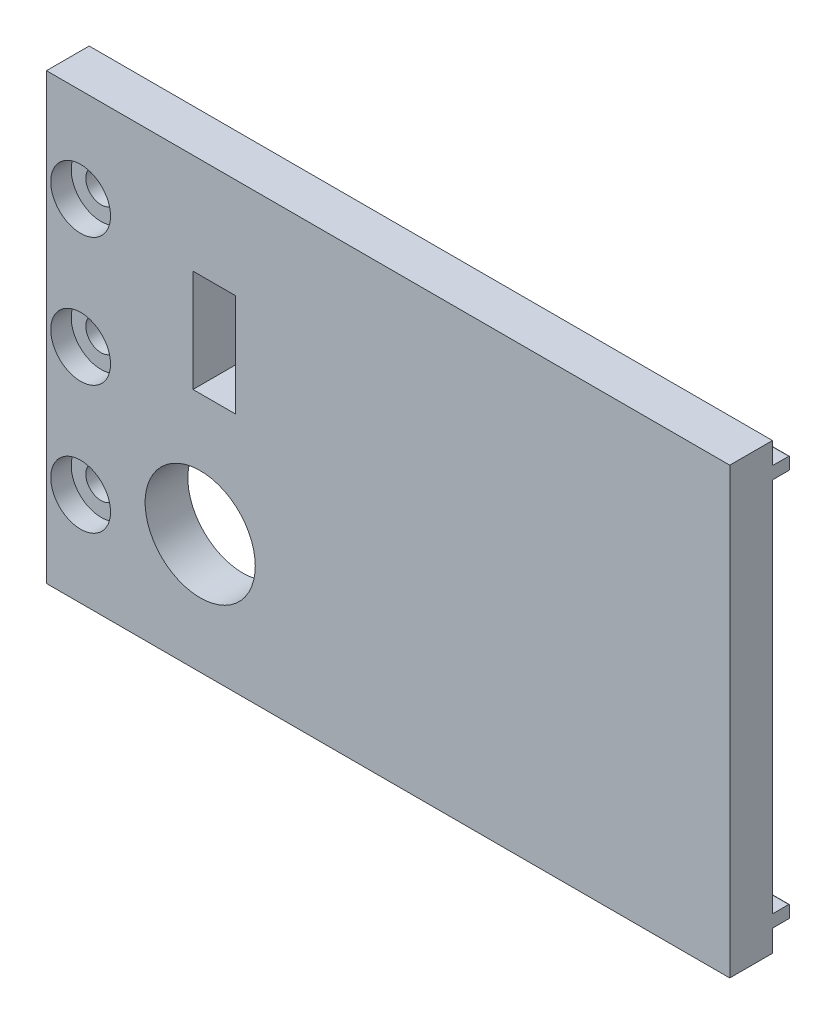
ISO-10303-21;
HEADER;
FILE_DESCRIPTION(('STEP AP214'),'2;1');
FILE_NAME('part.step','',(''),(''),'','','');
FILE_SCHEMA(('AUTOMOTIVE_DESIGN { 1 0 10303 214 1 1 1 1 }'));
ENDSEC;
DATA;
#1=APPLICATION_CONTEXT('core data for automotive mechanical design processes');
#2=APPLICATION_PROTOCOL_DEFINITION('international standard','automotive_design',2000,#1);
#3=PRODUCT_CONTEXT('',#1,'mechanical');
#4=PRODUCT('Part','Part','',(#3));
#5=PRODUCT_RELATED_PRODUCT_CATEGORY('part','',(#4));
#6=PRODUCT_DEFINITION_FORMATION('','',#4);
#7=PRODUCT_DEFINITION_CONTEXT('part definition',#1,'design');
#8=PRODUCT_DEFINITION('design','',#6,#7);
#9=PRODUCT_DEFINITION_SHAPE('','',#8);
#10=(LENGTH_UNIT() NAMED_UNIT(*) SI_UNIT(.MILLI.,.METRE.));
#11=(NAMED_UNIT(*) PLANE_ANGLE_UNIT() SI_UNIT($,.RADIAN.));
#12=(NAMED_UNIT(*) SI_UNIT($,.STERADIAN.) SOLID_ANGLE_UNIT());
#13=UNCERTAINTY_MEASURE_WITH_UNIT(LENGTH_MEASURE(1.E-05),#10,'distance_accuracy_value','');
#14=(GEOMETRIC_REPRESENTATION_CONTEXT(3) GLOBAL_UNCERTAINTY_ASSIGNED_CONTEXT((#13)) GLOBAL_UNIT_ASSIGNED_CONTEXT((#10,
#11,#12)) REPRESENTATION_CONTEXT('',''));
#15=CARTESIAN_POINT('',(0.,0.,0.));
#16=DIRECTION('',(0.,0.,1.));
#17=DIRECTION('',(1.,0.,0.));
#18=AXIS2_PLACEMENT_3D('',#15,#16,#17);
#19=CARTESIAN_POINT('',(0.,0.,16.9801166404574));
#20=DIRECTION('',(0.,0.,1.));
#21=DIRECTION('',(1.,0.,0.));
#22=AXIS2_PLACEMENT_3D('',#19,#20,#21);
#23=PLANE('',#22);
#24=DIRECTION('',(0.,1.,0.));
#25=VECTOR('',#24,1.);
#26=CARTESIAN_POINT('',(-76.4443030659333,46.0665693057306,16.9801166404574));
#27=LINE('',#26,#25);
#28=CARTESIAN_POINT('',(-76.4443030659333,45.9665693057306,16.9801166404574));
#29=VERTEX_POINT('',#28);
#30=CARTESIAN_POINT('',(-76.4443030659333,47.6165693057306,16.9801166404574));
#31=VERTEX_POINT('',#30);
#32=EDGE_CURVE('E249',#29,#31,#27,.T.);
#33=ORIENTED_EDGE('',*,*,#32,.F.);
#34=DIRECTION('',(-1.,0.,0.));
#35=VECTOR('',#34,1.);
#36=CARTESIAN_POINT('',(-4.4443030659333,45.9665693057306,16.9801166404574));
#37=LINE('',#36,#35);
#38=CARTESIAN_POINT('',(-4.44430306593331,45.9665693057306,16.9801166404574));
#39=VERTEX_POINT('',#38);
#40=EDGE_CURVE('E483',#29,#39,#37,.F.);
#41=ORIENTED_EDGE('',*,*,#40,.T.);
#42=DIRECTION('',(0.,1.,0.));
#43=VECTOR('',#42,1.);
#44=CARTESIAN_POINT('',(-4.44430306593331,50.0665693057306,16.9801166404574));
#45=LINE('',#44,#43);
#46=CARTESIAN_POINT('',(-4.4443030659333,2.16656930573062,16.9801166404574));
#47=VERTEX_POINT('',#46);
#48=EDGE_CURVE('E386',#47,#39,#45,.T.);
#49=ORIENTED_EDGE('',*,*,#48,.F.);
#50=DIRECTION('',(1.,0.,0.));
#51=VECTOR('',#50,1.);
#52=CARTESIAN_POINT('',(-76.4443030659333,2.16656930573061,16.9801166404574));
#53=LINE('',#52,#51);
#54=CARTESIAN_POINT('',(-76.4443030659333,2.16656930573061,16.9801166404574));
#55=VERTEX_POINT('',#54);
#56=EDGE_CURVE('E475',#47,#55,#53,.F.);
#57=ORIENTED_EDGE('',*,*,#56,.T.);
#58=DIRECTION('',(0.,1.,0.));
#59=VECTOR('',#58,1.);
#60=CARTESIAN_POINT('',(-76.4443030659333,2.06656930573061,16.9801166404574));
#61=LINE('',#60,#59);
#62=CARTESIAN_POINT('',(-76.4443030659333,0.516569305730608,16.9801166404574));
#63=VERTEX_POINT('',#62);
#64=EDGE_CURVE('E276',#63,#55,#61,.T.);
#65=ORIENTED_EDGE('',*,*,#64,.F.);
#66=DIRECTION('',(-1.,0.,0.));
#67=VECTOR('',#66,1.);
#68=CARTESIAN_POINT('',(-4.4443030659333,0.516569305730608,16.9801166404574));
#69=LINE('',#68,#67);
#70=CARTESIAN_POINT('',(-4.4443030659333,0.516569305730623,16.9801166404574));
#71=VERTEX_POINT('',#70);
#72=EDGE_CURVE('E472',#63,#71,#69,.F.);
#73=ORIENTED_EDGE('',*,*,#72,.T.);
#74=CARTESIAN_POINT('',(-4.4443030659333,-1.93343069426939,16.9801166404574));
#75=VERTEX_POINT('',#74);
#76=EDGE_CURVE('E382',#75,#71,#45,.T.);
#77=ORIENTED_EDGE('',*,*,#76,.F.);
#78=DIRECTION('',(1.,0.,0.));
#79=VECTOR('',#78,1.);
#80=CARTESIAN_POINT('',(-84.4443030659333,-1.93343069426939,16.9801166404574));
#81=LINE('',#80,#79);
#82=CARTESIAN_POINT('',(-84.4443030659333,-1.93343069426939,16.9801166404574));
#83=VERTEX_POINT('',#82);
#84=EDGE_CURVE('E378',#83,#75,#81,.T.);
#85=ORIENTED_EDGE('',*,*,#84,.F.);
#86=DIRECTION('',(0.,-1.,0.));
#87=VECTOR('',#86,1.);
#88=CARTESIAN_POINT('',(-84.4443030659333,50.0665693057306,16.9801166404574));
#89=LINE('',#88,#87);
#90=CARTESIAN_POINT('',(-84.4443030659333,50.0665693057306,16.9801166404574));
#91=VERTEX_POINT('',#90);
#92=EDGE_CURVE('E356',#91,#83,#89,.T.);
#93=ORIENTED_EDGE('',*,*,#92,.F.);
#94=DIRECTION('',(-1.,0.,0.));
#95=VECTOR('',#94,1.);
#96=CARTESIAN_POINT('',(-84.4443030659333,50.0665693057306,16.9801166404574));
#97=LINE('',#96,#95);
#98=CARTESIAN_POINT('',(-4.44430306593331,50.0665693057306,16.9801166404574));
#99=VERTEX_POINT('',#98);
#100=EDGE_CURVE('E365',#99,#91,#97,.T.);
#101=ORIENTED_EDGE('',*,*,#100,.F.);
#102=CARTESIAN_POINT('',(-4.44430306593331,47.6165693057306,16.9801166404574));
#103=VERTEX_POINT('',#102);
#104=EDGE_CURVE('E381',#103,#99,#45,.T.);
#105=ORIENTED_EDGE('',*,*,#104,.F.);
#106=DIRECTION('',(1.,0.,0.));
#107=VECTOR('',#106,1.);
#108=CARTESIAN_POINT('',(-76.4443030659333,47.6165693057306,16.9801166404574));
#109=LINE('',#108,#107);
#110=EDGE_CURVE('E479',#103,#31,#109,.F.);
#111=ORIENTED_EDGE('',*,*,#110,.T.);
#112=EDGE_LOOP('',(#33,#41,#49,#57,#65,#73,#77,#85,#93,#101,#105,#111));
#113=FACE_BOUND('',#112,.T.);
#114=CARTESIAN_POINT('',(-66.4443030659333,12.061734253213,16.9801166404574));
#115=DIRECTION('',(0.,0.,1.));
#116=DIRECTION('',(1.,0.,0.));
#117=AXIS2_PLACEMENT_3D('',#114,#115,#116);
#118=CIRCLE('',#117,6.44785946430932);
#119=CARTESIAN_POINT('',(-59.996443601624,12.061734253213,16.9801166404574));
#120=VERTEX_POINT('',#119);
#121=EDGE_CURVE('E352',#120,#120,#118,.T.);
#122=ORIENTED_EDGE('',*,*,#121,.T.);
#123=EDGE_LOOP('',(#122));
#124=FACE_BOUND('',#123,.T.);
#125=CARTESIAN_POINT('',(-80.4443030659333,39.0665693057306,16.9801166404574));
#126=DIRECTION('',(0.,0.,1.));
#127=DIRECTION('',(1.,0.,0.));
#128=AXIS2_PLACEMENT_3D('',#125,#126,#127);
#129=CIRCLE('',#128,1.8);
#130=CARTESIAN_POINT('',(-78.6443030659333,39.0665693057306,16.9801166404574));
#131=VERTEX_POINT('',#130);
#132=EDGE_CURVE('E347',#131,#131,#129,.T.);
#133=ORIENTED_EDGE('',*,*,#132,.T.);
#134=EDGE_LOOP('',(#133));
#135=FACE_BOUND('',#134,.T.);
#136=CARTESIAN_POINT('',(-80.4443030659333,24.0665693057306,16.9801166404574));
#137=DIRECTION('',(0.,0.,1.));
#138=DIRECTION('',(1.,0.,0.));
#139=AXIS2_PLACEMENT_3D('',#136,#137,#138);
#140=CIRCLE('',#139,1.8);
#141=CARTESIAN_POINT('',(-78.6443030659333,24.0665693057306,16.9801166404574));
#142=VERTEX_POINT('',#141);
#143=EDGE_CURVE('E331',#142,#142,#140,.T.);
#144=ORIENTED_EDGE('',*,*,#143,.T.);
#145=EDGE_LOOP('',(#144));
#146=FACE_BOUND('',#145,.T.);
#147=CARTESIAN_POINT('',(-80.4443030659333,9.06656930573061,16.9801166404574));
#148=DIRECTION('',(0.,0.,1.));
#149=DIRECTION('',(1.,0.,0.));
#150=AXIS2_PLACEMENT_3D('',#147,#148,#149);
#151=CIRCLE('',#150,1.8);
#152=CARTESIAN_POINT('',(-78.6443030659333,9.06656930573061,16.9801166404574));
#153=VERTEX_POINT('',#152);
#154=EDGE_CURVE('E315',#153,#153,#151,.T.);
#155=ORIENTED_EDGE('',*,*,#154,.T.);
#156=EDGE_LOOP('',(#155));
#157=FACE_BOUND('',#156,.T.);
#158=DIRECTION('',(1.,0.,0.));
#159=VECTOR('',#158,1.);
#160=CARTESIAN_POINT('',(0.,38.3184308689191,16.9801166404574));
#161=LINE('',#160,#159);
#162=CARTESIAN_POINT('',(-67.2884592835885,38.3184308689191,16.9801166404574));
#163=VERTEX_POINT('',#162);
#164=CARTESIAN_POINT('',(-62.2884592835885,38.3184308689191,16.9801166404574));
#165=VERTEX_POINT('',#164);
#166=EDGE_CURVE('E203',#163,#165,#161,.T.);
#167=ORIENTED_EDGE('',*,*,#166,.F.);
#168=DIRECTION('',(0.,-1.,0.));
#169=VECTOR('',#168,1.);
#170=CARTESIAN_POINT('',(-67.2884592835885,0.,16.9801166404574));
#171=LINE('',#170,#169);
#172=CARTESIAN_POINT('',(-67.2884592835885,26.3184308689191,16.9801166404574));
#173=VERTEX_POINT('',#172);
#174=EDGE_CURVE('E207',#163,#173,#171,.T.);
#175=ORIENTED_EDGE('',*,*,#174,.T.);
#176=DIRECTION('',(1.,0.,0.));
#177=VECTOR('',#176,1.);
#178=CARTESIAN_POINT('',(0.,26.318430868919,16.9801166404574));
#179=LINE('',#178,#177);
#180=CARTESIAN_POINT('',(-62.2884592835885,26.318430868919,16.9801166404574));
#181=VERTEX_POINT('',#180);
#182=EDGE_CURVE('E240',#173,#181,#179,.T.);
#183=ORIENTED_EDGE('',*,*,#182,.T.);
#184=DIRECTION('',(0.,-1.,0.));
#185=VECTOR('',#184,1.);
#186=CARTESIAN_POINT('',(-62.2884592835885,0.,16.9801166404574));
#187=LINE('',#186,#185);
#188=EDGE_CURVE('E244',#165,#181,#187,.T.);
#189=ORIENTED_EDGE('',*,*,#188,.F.);
#190=EDGE_LOOP('',(#167,#175,#183,#189));
#191=FACE_BOUND('',#190,.T.);
#192=ADVANCED_FACE('F39',(#113,#124,#135,#146,#157,#191),#23,.F.);
#193=CARTESIAN_POINT('',(0.,0.,21.9801166404574));
#194=DIRECTION('',(0.,0.,1.));
#195=DIRECTION('',(1.,0.,0.));
#196=AXIS2_PLACEMENT_3D('',#193,#194,#195);
#197=PLANE('',#196);
#198=CARTESIAN_POINT('',(-80.4443030659333,9.06656930573061,21.9801166404574));
#199=DIRECTION('',(0.,0.,1.));
#200=DIRECTION('',(1.,0.,0.));
#201=AXIS2_PLACEMENT_3D('',#198,#199,#200);
#202=CIRCLE('',#201,3.5);
#203=CARTESIAN_POINT('',(-76.9443030659333,9.06656930573061,21.9801166404574));
#204=VERTEX_POINT('',#203);
#205=EDGE_CURVE('E303',#204,#204,#202,.T.);
#206=ORIENTED_EDGE('',*,*,#205,.F.);
#207=EDGE_LOOP('',(#206));
#208=FACE_BOUND('',#207,.T.);
#209=CARTESIAN_POINT('',(-80.4443030659333,24.0665693057306,21.9801166404574));
#210=DIRECTION('',(0.,0.,1.));
#211=DIRECTION('',(1.,0.,0.));
#212=AXIS2_PLACEMENT_3D('',#209,#210,#211);
#213=CIRCLE('',#212,3.5);
#214=CARTESIAN_POINT('',(-76.9443030659333,24.0665693057306,21.9801166404574));
#215=VERTEX_POINT('',#214);
#216=EDGE_CURVE('E319',#215,#215,#213,.T.);
#217=ORIENTED_EDGE('',*,*,#216,.F.);
#218=EDGE_LOOP('',(#217));
#219=FACE_BOUND('',#218,.T.);
#220=CARTESIAN_POINT('',(-80.4443030659333,39.0665693057306,21.9801166404574));
#221=DIRECTION('',(0.,0.,1.));
#222=DIRECTION('',(1.,0.,0.));
#223=AXIS2_PLACEMENT_3D('',#220,#221,#222);
#224=CIRCLE('',#223,3.5);
#225=CARTESIAN_POINT('',(-76.9443030659333,39.0665693057306,21.9801166404574));
#226=VERTEX_POINT('',#225);
#227=EDGE_CURVE('E335',#226,#226,#224,.T.);
#228=ORIENTED_EDGE('',*,*,#227,.F.);
#229=EDGE_LOOP('',(#228));
#230=FACE_BOUND('',#229,.T.);
#231=CARTESIAN_POINT('',(-66.4443030659333,12.061734253213,21.9801166404574));
#232=DIRECTION('',(0.,0.,1.));
#233=DIRECTION('',(1.,0.,0.));
#234=AXIS2_PLACEMENT_3D('',#231,#232,#233);
#235=CIRCLE('',#234,6.44785946430932);
#236=CARTESIAN_POINT('',(-59.996443601624,12.061734253213,21.9801166404574));
#237=VERTEX_POINT('',#236);
#238=EDGE_CURVE('E351',#237,#237,#235,.T.);
#239=ORIENTED_EDGE('',*,*,#238,.F.);
#240=EDGE_LOOP('',(#239));
#241=FACE_BOUND('',#240,.T.);
#242=DIRECTION('',(0.,-1.,0.));
#243=VECTOR('',#242,1.);
#244=CARTESIAN_POINT('',(-84.4443030659333,50.0665693057306,21.9801166404574));
#245=LINE('',#244,#243);
#246=CARTESIAN_POINT('',(-84.4443030659333,50.0665693057306,21.9801166404574));
#247=VERTEX_POINT('',#246);
#248=CARTESIAN_POINT('',(-84.4443030659333,-1.93343069426939,21.9801166404574));
#249=VERTEX_POINT('',#248);
#250=EDGE_CURVE('E360',#247,#249,#245,.T.);
#251=ORIENTED_EDGE('',*,*,#250,.T.);
#252=DIRECTION('',(1.,0.,0.));
#253=VECTOR('',#252,1.);
#254=CARTESIAN_POINT('',(-84.4443030659333,-1.93343069426939,21.9801166404574));
#255=LINE('',#254,#253);
#256=CARTESIAN_POINT('',(-4.4443030659333,-1.93343069426939,21.9801166404574));
#257=VERTEX_POINT('',#256);
#258=EDGE_CURVE('E364',#249,#257,#255,.T.);
#259=ORIENTED_EDGE('',*,*,#258,.T.);
#260=DIRECTION('',(0.,1.,0.));
#261=VECTOR('',#260,1.);
#262=CARTESIAN_POINT('',(-4.44430306593331,50.0665693057306,21.9801166404574));
#263=LINE('',#262,#261);
#264=CARTESIAN_POINT('',(-4.44430306593331,50.0665693057306,21.9801166404574));
#265=VERTEX_POINT('',#264);
#266=EDGE_CURVE('E368',#257,#265,#263,.T.);
#267=ORIENTED_EDGE('',*,*,#266,.T.);
#268=DIRECTION('',(-1.,0.,0.));
#269=VECTOR('',#268,1.);
#270=CARTESIAN_POINT('',(-84.4443030659333,50.0665693057306,21.9801166404574));
#271=LINE('',#270,#269);
#272=EDGE_CURVE('E371',#265,#247,#271,.T.);
#273=ORIENTED_EDGE('',*,*,#272,.T.);
#274=EDGE_LOOP('',(#251,#259,#267,#273));
#275=FACE_BOUND('',#274,.T.);
#276=DIRECTION('',(0.,-1.,0.));
#277=VECTOR('',#276,1.);
#278=CARTESIAN_POINT('',(-67.2884592835885,38.3184308689191,21.9801166404574));
#279=LINE('',#278,#277);
#280=CARTESIAN_POINT('',(-67.2884592835885,38.3184308689191,21.9801166404574));
#281=VERTEX_POINT('',#280);
#282=CARTESIAN_POINT('',(-67.2884592835885,26.3184308689191,21.9801166404574));
#283=VERTEX_POINT('',#282);
#284=EDGE_CURVE('E222',#281,#283,#279,.T.);
#285=ORIENTED_EDGE('',*,*,#284,.F.);
#286=DIRECTION('',(1.,0.,0.));
#287=VECTOR('',#286,1.);
#288=CARTESIAN_POINT('',(-67.2884592835885,38.3184308689191,21.9801166404574));
#289=LINE('',#288,#287);
#290=CARTESIAN_POINT('',(-62.2884592835885,38.3184308689191,21.9801166404574));
#291=VERTEX_POINT('',#290);
#292=EDGE_CURVE('E63',#281,#291,#289,.T.);
#293=ORIENTED_EDGE('',*,*,#292,.T.);
#294=DIRECTION('',(0.,-1.,0.));
#295=VECTOR('',#294,1.);
#296=CARTESIAN_POINT('',(-62.2884592835885,38.3184308689191,21.9801166404574));
#297=LINE('',#296,#295);
#298=CARTESIAN_POINT('',(-62.2884592835885,26.318430868919,21.9801166404574));
#299=VERTEX_POINT('',#298);
#300=EDGE_CURVE('E211',#291,#299,#297,.T.);
#301=ORIENTED_EDGE('',*,*,#300,.T.);
#302=DIRECTION('',(1.,0.,0.));
#303=VECTOR('',#302,1.);
#304=CARTESIAN_POINT('',(-67.2884592835885,26.3184308689191,21.9801166404574));
#305=LINE('',#304,#303);
#306=EDGE_CURVE('E218',#283,#299,#305,.T.);
#307=ORIENTED_EDGE('',*,*,#306,.F.);
#308=EDGE_LOOP('',(#285,#293,#301,#307));
#309=FACE_BOUND('',#308,.T.);
#310=ADVANCED_FACE('F221',(#208,#219,#230,#241,#275,#309),#197,.T.);
#311=CARTESIAN_POINT('',(-84.4443030659333,50.0665693057306,21.9801166404574));
#312=DIRECTION('',(1.,0.,0.));
#313=DIRECTION('',(0.,1.,0.));
#314=AXIS2_PLACEMENT_3D('',#311,#312,#313);
#315=PLANE('',#314);
#316=ORIENTED_EDGE('',*,*,#92,.T.);
#317=DIRECTION('',(0.,0.,-1.));
#318=VECTOR('',#317,1.);
#319=CARTESIAN_POINT('',(-84.4443030659333,-1.93343069426939,21.9801166404574));
#320=LINE('',#319,#318);
#321=EDGE_CURVE('E400',#249,#83,#320,.T.);
#322=ORIENTED_EDGE('',*,*,#321,.F.);
#323=ORIENTED_EDGE('',*,*,#250,.F.);
#324=DIRECTION('',(0.,0.,-1.));
#325=VECTOR('',#324,1.);
#326=CARTESIAN_POINT('',(-84.4443030659333,50.0665693057306,21.9801166404574));
#327=LINE('',#326,#325);
#328=EDGE_CURVE('E374',#247,#91,#327,.T.);
#329=ORIENTED_EDGE('',*,*,#328,.T.);
#330=EDGE_LOOP('',(#316,#322,#323,#329));
#331=FACE_BOUND('',#330,.T.);
#332=ADVANCED_FACE('F530',(#331),#315,.F.);
#333=CARTESIAN_POINT('',(-84.4443030659333,-1.93343069426939,21.9801166404574));
#334=DIRECTION('',(0.,1.,0.));
#335=DIRECTION('',(0.,0.,1.));
#336=AXIS2_PLACEMENT_3D('',#333,#334,#335);
#337=PLANE('',#336);
#338=ORIENTED_EDGE('',*,*,#84,.T.);
#339=DIRECTION('',(0.,0.,-1.));
#340=VECTOR('',#339,1.);
#341=CARTESIAN_POINT('',(-4.4443030659333,-1.93343069426939,21.9801166404574));
#342=LINE('',#341,#340);
#343=EDGE_CURVE('E396',#257,#75,#342,.T.);
#344=ORIENTED_EDGE('',*,*,#343,.F.);
#345=ORIENTED_EDGE('',*,*,#258,.F.);
#346=ORIENTED_EDGE('',*,*,#321,.T.);
#347=EDGE_LOOP('',(#338,#344,#345,#346));
#348=FACE_BOUND('',#347,.T.);
#349=ADVANCED_FACE('F524',(#348),#337,.F.);
#350=CARTESIAN_POINT('',(-4.44430306593331,50.0665693057306,21.9801166404574));
#351=DIRECTION('',(-1.,0.,0.));
#352=DIRECTION('',(0.,-1.,0.));
#353=AXIS2_PLACEMENT_3D('',#350,#351,#352);
#354=PLANE('',#353);
#355=DIRECTION('',(0.,0.,1.));
#356=VECTOR('',#355,1.);
#357=CARTESIAN_POINT('',(-4.4443030659333,0.616569305730608,14.9801166404574));
#358=LINE('',#357,#356);
#359=CARTESIAN_POINT('',(-4.4443030659333,0.616569305730608,15.0801166404574));
#360=VERTEX_POINT('',#359);
#361=CARTESIAN_POINT('',(-4.4443030659333,0.616569305730608,16.8801166404574));
#362=VERTEX_POINT('',#361);
#363=EDGE_CURVE('E299',#360,#362,#358,.T.);
#364=ORIENTED_EDGE('',*,*,#363,.F.);
#365=CARTESIAN_POINT('',(-4.4443030659333,0.716569305730608,15.0801166404574));
#366=DIRECTION('',(-1.,0.,0.));
#367=DIRECTION('',(0.,-1.,0.));
#368=AXIS2_PLACEMENT_3D('',#365,#366,#367);
#369=CIRCLE('',#368,0.1);
#370=CARTESIAN_POINT('',(-4.4443030659333,0.716569305730608,14.9801166404574));
#371=VERTEX_POINT('',#370);
#372=EDGE_CURVE('E434',#360,#371,#369,.F.);
#373=ORIENTED_EDGE('',*,*,#372,.T.);
#374=DIRECTION('',(0.,-1.,0.));
#375=VECTOR('',#374,1.);
#376=CARTESIAN_POINT('',(-4.4443030659333,2.06656930573061,14.9801166404574));
#377=LINE('',#376,#375);
#378=CARTESIAN_POINT('',(-4.4443030659333,1.96656930573061,14.9801166404574));
#379=VERTEX_POINT('',#378);
#380=EDGE_CURVE('E277',#379,#371,#377,.T.);
#381=ORIENTED_EDGE('',*,*,#380,.F.);
#382=CARTESIAN_POINT('',(-4.4443030659333,1.96656930573061,15.0801166404574));
#383=DIRECTION('',(-1.,0.,0.));
#384=DIRECTION('',(0.,-1.,0.));
#385=AXIS2_PLACEMENT_3D('',#382,#383,#384);
#386=CIRCLE('',#385,0.1);
#387=CARTESIAN_POINT('',(-4.4443030659333,2.06656930573061,15.0801166404574));
#388=VERTEX_POINT('',#387);
#389=EDGE_CURVE('E431',#379,#388,#386,.F.);
#390=ORIENTED_EDGE('',*,*,#389,.T.);
#391=DIRECTION('',(0.,0.,1.));
#392=VECTOR('',#391,1.);
#393=CARTESIAN_POINT('',(-4.4443030659333,2.06656930573061,14.9801166404574));
#394=LINE('',#393,#392);
#395=CARTESIAN_POINT('',(-4.4443030659333,2.06656930573061,16.8801166404574));
#396=VERTEX_POINT('',#395);
#397=EDGE_CURVE('E285',#388,#396,#394,.T.);
#398=ORIENTED_EDGE('',*,*,#397,.T.);
#399=CARTESIAN_POINT('',(-4.4443030659333,2.16656930573061,16.8801166404574));
#400=DIRECTION('',(-1.,0.,0.));
#401=DIRECTION('',(0.,-1.,0.));
#402=AXIS2_PLACEMENT_3D('',#399,#400,#401);
#403=CIRCLE('',#402,0.1);
#404=EDGE_CURVE('E499',#396,#47,#403,.T.);
#405=ORIENTED_EDGE('',*,*,#404,.T.);
#406=ORIENTED_EDGE('',*,*,#48,.T.);
#407=CARTESIAN_POINT('',(-4.44430306593331,45.9665693057306,16.8801166404574));
#408=DIRECTION('',(-1.,0.,0.));
#409=DIRECTION('',(0.,-1.,0.));
#410=AXIS2_PLACEMENT_3D('',#407,#408,#409);
#411=CIRCLE('',#410,0.1);
#412=CARTESIAN_POINT('',(-4.4443030659333,46.0665693057306,16.8801166404574));
#413=VERTEX_POINT('',#412);
#414=EDGE_CURVE('E490',#39,#413,#411,.T.);
#415=ORIENTED_EDGE('',*,*,#414,.T.);
#416=DIRECTION('',(0.,0.,1.));
#417=VECTOR('',#416,1.);
#418=CARTESIAN_POINT('',(-4.4443030659333,46.0665693057306,14.9801166404574));
#419=LINE('',#418,#417);
#420=CARTESIAN_POINT('',(-4.4443030659333,46.0665693057306,15.0801166404574));
#421=VERTEX_POINT('',#420);
#422=EDGE_CURVE('E258',#421,#413,#419,.T.);
#423=ORIENTED_EDGE('',*,*,#422,.F.);
#424=CARTESIAN_POINT('',(-4.44430306593331,46.1665693057306,15.0801166404574));
#425=DIRECTION('',(-1.,0.,0.));
#426=DIRECTION('',(0.,-1.,0.));
#427=AXIS2_PLACEMENT_3D('',#424,#425,#426);
#428=CIRCLE('',#427,0.1);
#429=CARTESIAN_POINT('',(-4.4443030659333,46.1665693057306,14.9801166404574));
#430=VERTEX_POINT('',#429);
#431=EDGE_CURVE('E425',#421,#430,#428,.F.);
#432=ORIENTED_EDGE('',*,*,#431,.T.);
#433=DIRECTION('',(0.,-1.,0.));
#434=VECTOR('',#433,1.);
#435=CARTESIAN_POINT('',(-4.4443030659333,46.0665693057306,14.9801166404574));
#436=LINE('',#435,#434);
#437=CARTESIAN_POINT('',(-4.4443030659333,47.4165693057306,14.9801166404574));
#438=VERTEX_POINT('',#437);
#439=EDGE_CURVE('E254',#438,#430,#436,.T.);
#440=ORIENTED_EDGE('',*,*,#439,.F.);
#441=CARTESIAN_POINT('',(-4.44430306593331,47.4165693057306,15.0801166404574));
#442=DIRECTION('',(-1.,0.,0.));
#443=DIRECTION('',(0.,-1.,0.));
#444=AXIS2_PLACEMENT_3D('',#441,#442,#443);
#445=CIRCLE('',#444,0.1);
#446=CARTESIAN_POINT('',(-4.4443030659333,47.5165693057306,15.0801166404574));
#447=VERTEX_POINT('',#446);
#448=EDGE_CURVE('E428',#438,#447,#445,.F.);
#449=ORIENTED_EDGE('',*,*,#448,.T.);
#450=DIRECTION('',(0.,0.,1.));
#451=VECTOR('',#450,1.);
#452=CARTESIAN_POINT('',(-4.4443030659333,47.5165693057306,14.9801166404574));
#453=LINE('',#452,#451);
#454=CARTESIAN_POINT('',(-4.4443030659333,47.5165693057306,16.8801166404574));
#455=VERTEX_POINT('',#454);
#456=EDGE_CURVE('E264',#447,#455,#453,.T.);
#457=ORIENTED_EDGE('',*,*,#456,.T.);
#458=CARTESIAN_POINT('',(-4.44430306593331,47.6165693057306,16.8801166404574));
#459=DIRECTION('',(-1.,0.,0.));
#460=DIRECTION('',(0.,-1.,0.));
#461=AXIS2_PLACEMENT_3D('',#458,#459,#460);
#462=CIRCLE('',#461,0.1);
#463=EDGE_CURVE('E493',#455,#103,#462,.T.);
#464=ORIENTED_EDGE('',*,*,#463,.T.);
#465=ORIENTED_EDGE('',*,*,#104,.T.);
#466=DIRECTION('',(0.,0.,-1.));
#467=VECTOR('',#466,1.);
#468=CARTESIAN_POINT('',(-4.44430306593331,50.0665693057306,21.9801166404574));
#469=LINE('',#468,#467);
#470=EDGE_CURVE('E392',#265,#99,#469,.T.);
#471=ORIENTED_EDGE('',*,*,#470,.F.);
#472=ORIENTED_EDGE('',*,*,#266,.F.);
#473=ORIENTED_EDGE('',*,*,#343,.T.);
#474=ORIENTED_EDGE('',*,*,#76,.T.);
#475=CARTESIAN_POINT('',(-4.4443030659333,0.516569305730608,16.8801166404574));
#476=DIRECTION('',(-1.,0.,0.));
#477=DIRECTION('',(0.,-1.,0.));
#478=AXIS2_PLACEMENT_3D('',#475,#476,#477);
#479=CIRCLE('',#478,0.1);
#480=EDGE_CURVE('E11',#71,#362,#479,.T.);
#481=ORIENTED_EDGE('',*,*,#480,.T.);
#482=EDGE_LOOP('',(#364,#373,#381,#390,#398,#405,#406,#415,#423,#432,#440,#449,#457,#464,#465,
#471,#472,#473,#474,#481));
#483=FACE_BOUND('',#482,.T.);
#484=ADVANCED_FACE('F519',(#483),#354,.F.);
#485=CARTESIAN_POINT('',(-84.4443030659333,50.0665693057306,21.9801166404574));
#486=DIRECTION('',(0.,-1.,0.));
#487=DIRECTION('',(0.,0.,-1.));
#488=AXIS2_PLACEMENT_3D('',#485,#486,#487);
#489=PLANE('',#488);
#490=ORIENTED_EDGE('',*,*,#100,.T.);
#491=ORIENTED_EDGE('',*,*,#328,.F.);
#492=ORIENTED_EDGE('',*,*,#272,.F.);
#493=ORIENTED_EDGE('',*,*,#470,.T.);
#494=EDGE_LOOP('',(#490,#491,#492,#493));
#495=FACE_BOUND('',#494,.T.);
#496=ADVANCED_FACE('F535',(#495),#489,.F.);
#497=CARTESIAN_POINT('',(-66.4443030659333,12.061734253213,16.9801166404574));
#498=DIRECTION('',(0.,0.,1.));
#499=DIRECTION('',(1.,0.,0.));
#500=AXIS2_PLACEMENT_3D('',#497,#498,#499);
#501=CYLINDRICAL_SURFACE('',#500,6.44785946430932);
#502=ORIENTED_EDGE('',*,*,#121,.F.);
#503=EDGE_LOOP('',(#502));
#504=FACE_BOUND('',#503,.T.);
#505=ORIENTED_EDGE('',*,*,#238,.T.);
#506=EDGE_LOOP('',(#505));
#507=FACE_BOUND('',#506,.T.);
#508=ADVANCED_FACE('F596',(#504,#507),#501,.F.);
#509=CARTESIAN_POINT('',(-80.4443030659333,39.0665693057306,21.9801166404574));
#510=DIRECTION('',(0.,0.,1.));
#511=DIRECTION('',(1.,0.,0.));
#512=AXIS2_PLACEMENT_3D('',#509,#510,#511);
#513=CYLINDRICAL_SURFACE('',#512,1.8);
#514=ORIENTED_EDGE('',*,*,#132,.F.);
#515=EDGE_LOOP('',(#514));
#516=FACE_BOUND('',#515,.T.);
#517=CARTESIAN_POINT('',(-80.4443030659333,39.0665693057306,19.5801166404574));
#518=DIRECTION('',(0.,0.,1.));
#519=DIRECTION('',(1.,0.,0.));
#520=AXIS2_PLACEMENT_3D('',#517,#518,#519);
#521=CIRCLE('',#520,1.8);
#522=CARTESIAN_POINT('',(-78.6443030659333,39.0665693057306,19.5801166404574));
#523=VERTEX_POINT('',#522);
#524=EDGE_CURVE('E343',#523,#523,#521,.T.);
#525=ORIENTED_EDGE('',*,*,#524,.T.);
#526=EDGE_LOOP('',(#525));
#527=FACE_BOUND('',#526,.T.);
#528=ADVANCED_FACE('F740',(#516,#527),#513,.F.);
#529=CARTESIAN_POINT('',(-78.6443030659333,39.0665693057306,19.5801166404574));
#530=DIRECTION('',(0.,0.,-1.));
#531=DIRECTION('',(-1.,0.,0.));
#532=AXIS2_PLACEMENT_3D('',#529,#530,#531);
#533=PLANE('',#532);
#534=ORIENTED_EDGE('',*,*,#524,.F.);
#535=EDGE_LOOP('',(#534));
#536=FACE_BOUND('',#535,.T.);
#537=CARTESIAN_POINT('',(-80.4443030659333,39.0665693057306,19.5801166404574));
#538=DIRECTION('',(0.,0.,1.));
#539=DIRECTION('',(1.,0.,0.));
#540=AXIS2_PLACEMENT_3D('',#537,#538,#539);
#541=CIRCLE('',#540,3.5);
#542=CARTESIAN_POINT('',(-76.9443030659333,39.0665693057306,19.5801166404574));
#543=VERTEX_POINT('',#542);
#544=EDGE_CURVE('E339',#543,#543,#541,.T.);
#545=ORIENTED_EDGE('',*,*,#544,.T.);
#546=EDGE_LOOP('',(#545));
#547=FACE_BOUND('',#546,.T.);
#548=ADVANCED_FACE('F736',(#536,#547),#533,.F.);
#549=CARTESIAN_POINT('',(-80.4443030659333,39.0665693057306,21.9801166404574));
#550=DIRECTION('',(0.,0.,1.));
#551=DIRECTION('',(1.,0.,0.));
#552=AXIS2_PLACEMENT_3D('',#549,#550,#551);
#553=CYLINDRICAL_SURFACE('',#552,3.5);
#554=ORIENTED_EDGE('',*,*,#544,.F.);
#555=EDGE_LOOP('',(#554));
#556=FACE_BOUND('',#555,.T.);
#557=ORIENTED_EDGE('',*,*,#227,.T.);
#558=EDGE_LOOP('',(#557));
#559=FACE_BOUND('',#558,.T.);
#560=ADVANCED_FACE('F732',(#556,#559),#553,.F.);
#561=CARTESIAN_POINT('',(-80.4443030659333,24.0665693057306,21.9801166404574));
#562=DIRECTION('',(0.,0.,1.));
#563=DIRECTION('',(1.,0.,0.));
#564=AXIS2_PLACEMENT_3D('',#561,#562,#563);
#565=CYLINDRICAL_SURFACE('',#564,1.8);
#566=ORIENTED_EDGE('',*,*,#143,.F.);
#567=EDGE_LOOP('',(#566));
#568=FACE_BOUND('',#567,.T.);
#569=CARTESIAN_POINT('',(-80.4443030659333,24.0665693057306,19.5801166404574));
#570=DIRECTION('',(0.,0.,1.));
#571=DIRECTION('',(1.,0.,0.));
#572=AXIS2_PLACEMENT_3D('',#569,#570,#571);
#573=CIRCLE('',#572,1.8);
#574=CARTESIAN_POINT('',(-78.6443030659333,24.0665693057306,19.5801166404574));
#575=VERTEX_POINT('',#574);
#576=EDGE_CURVE('E327',#575,#575,#573,.T.);
#577=ORIENTED_EDGE('',*,*,#576,.T.);
#578=EDGE_LOOP('',(#577));
#579=FACE_BOUND('',#578,.T.);
#580=ADVANCED_FACE('F728',(#568,#579),#565,.F.);
#581=CARTESIAN_POINT('',(-78.6443030659333,24.0665693057306,19.5801166404574));
#582=DIRECTION('',(0.,0.,-1.));
#583=DIRECTION('',(-1.,0.,0.));
#584=AXIS2_PLACEMENT_3D('',#581,#582,#583);
#585=PLANE('',#584);
#586=ORIENTED_EDGE('',*,*,#576,.F.);
#587=EDGE_LOOP('',(#586));
#588=FACE_BOUND('',#587,.T.);
#589=CARTESIAN_POINT('',(-80.4443030659333,24.0665693057306,19.5801166404574));
#590=DIRECTION('',(0.,0.,1.));
#591=DIRECTION('',(1.,0.,0.));
#592=AXIS2_PLACEMENT_3D('',#589,#590,#591);
#593=CIRCLE('',#592,3.5);
#594=CARTESIAN_POINT('',(-76.9443030659333,24.0665693057306,19.5801166404574));
#595=VERTEX_POINT('',#594);
#596=EDGE_CURVE('E323',#595,#595,#593,.T.);
#597=ORIENTED_EDGE('',*,*,#596,.T.);
#598=EDGE_LOOP('',(#597));
#599=FACE_BOUND('',#598,.T.);
#600=ADVANCED_FACE('F724',(#588,#599),#585,.F.);
#601=CARTESIAN_POINT('',(-80.4443030659333,24.0665693057306,21.9801166404574));
#602=DIRECTION('',(0.,0.,1.));
#603=DIRECTION('',(1.,0.,0.));
#604=AXIS2_PLACEMENT_3D('',#601,#602,#603);
#605=CYLINDRICAL_SURFACE('',#604,3.5);
#606=ORIENTED_EDGE('',*,*,#596,.F.);
#607=EDGE_LOOP('',(#606));
#608=FACE_BOUND('',#607,.T.);
#609=ORIENTED_EDGE('',*,*,#216,.T.);
#610=EDGE_LOOP('',(#609));
#611=FACE_BOUND('',#610,.T.);
#612=ADVANCED_FACE('F720',(#608,#611),#605,.F.);
#613=CARTESIAN_POINT('',(-80.4443030659333,9.06656930573061,21.9801166404574));
#614=DIRECTION('',(0.,0.,1.));
#615=DIRECTION('',(1.,0.,0.));
#616=AXIS2_PLACEMENT_3D('',#613,#614,#615);
#617=CYLINDRICAL_SURFACE('',#616,1.8);
#618=ORIENTED_EDGE('',*,*,#154,.F.);
#619=EDGE_LOOP('',(#618));
#620=FACE_BOUND('',#619,.T.);
#621=CARTESIAN_POINT('',(-80.4443030659333,9.06656930573061,19.5801166404574));
#622=DIRECTION('',(0.,0.,1.));
#623=DIRECTION('',(1.,0.,0.));
#624=AXIS2_PLACEMENT_3D('',#621,#622,#623);
#625=CIRCLE('',#624,1.8);
#626=CARTESIAN_POINT('',(-78.6443030659333,9.06656930573061,19.5801166404574));
#627=VERTEX_POINT('',#626);
#628=EDGE_CURVE('E311',#627,#627,#625,.T.);
#629=ORIENTED_EDGE('',*,*,#628,.T.);
#630=EDGE_LOOP('',(#629));
#631=FACE_BOUND('',#630,.T.);
#632=ADVANCED_FACE('F716',(#620,#631),#617,.F.);
#633=CARTESIAN_POINT('',(-78.6443030659333,9.06656930573061,19.5801166404574));
#634=DIRECTION('',(0.,0.,-1.));
#635=DIRECTION('',(-1.,0.,0.));
#636=AXIS2_PLACEMENT_3D('',#633,#634,#635);
#637=PLANE('',#636);
#638=ORIENTED_EDGE('',*,*,#628,.F.);
#639=EDGE_LOOP('',(#638));
#640=FACE_BOUND('',#639,.T.);
#641=CARTESIAN_POINT('',(-80.4443030659333,9.06656930573061,19.5801166404574));
#642=DIRECTION('',(0.,0.,1.));
#643=DIRECTION('',(1.,0.,0.));
#644=AXIS2_PLACEMENT_3D('',#641,#642,#643);
#645=CIRCLE('',#644,3.5);
#646=CARTESIAN_POINT('',(-76.9443030659333,9.06656930573061,19.5801166404574));
#647=VERTEX_POINT('',#646);
#648=EDGE_CURVE('E307',#647,#647,#645,.T.);
#649=ORIENTED_EDGE('',*,*,#648,.T.);
#650=EDGE_LOOP('',(#649));
#651=FACE_BOUND('',#650,.T.);
#652=ADVANCED_FACE('F712',(#640,#651),#637,.F.);
#653=CARTESIAN_POINT('',(-80.4443030659333,9.06656930573061,21.9801166404574));
#654=DIRECTION('',(0.,0.,1.));
#655=DIRECTION('',(1.,0.,0.));
#656=AXIS2_PLACEMENT_3D('',#653,#654,#655);
#657=CYLINDRICAL_SURFACE('',#656,3.5);
#658=ORIENTED_EDGE('',*,*,#648,.F.);
#659=EDGE_LOOP('',(#658));
#660=FACE_BOUND('',#659,.T.);
#661=ORIENTED_EDGE('',*,*,#205,.T.);
#662=EDGE_LOOP('',(#661));
#663=FACE_BOUND('',#662,.T.);
#664=ADVANCED_FACE('F708',(#660,#663),#657,.F.);
#665=CARTESIAN_POINT('',(-4.4443030659333,0.616569305730608,14.9801166404574));
#666=DIRECTION('',(0.,1.,0.));
#667=DIRECTION('',(0.,0.,1.));
#668=AXIS2_PLACEMENT_3D('',#665,#666,#667);
#669=PLANE('',#668);
#670=DIRECTION('',(0.,0.,1.));
#671=VECTOR('',#670,1.);
#672=CARTESIAN_POINT('',(-76.4443030659333,0.616569305730608,14.9801166404574));
#673=LINE('',#672,#671);
#674=CARTESIAN_POINT('',(-76.4443030659333,0.616569305730608,15.0801166404574));
#675=VERTEX_POINT('',#674);
#676=CARTESIAN_POINT('',(-76.4443030659333,0.616569305730608,16.8801166404574));
#677=VERTEX_POINT('',#676);
#678=EDGE_CURVE('E295',#675,#677,#673,.T.);
#679=ORIENTED_EDGE('',*,*,#678,.F.);
#680=DIRECTION('',(-1.,0.,0.));
#681=VECTOR('',#680,1.);
#682=CARTESIAN_POINT('',(-4.4443030659333,0.616569305730608,15.0801166404574));
#683=LINE('',#682,#681);
#684=EDGE_CURVE('E422',#675,#360,#683,.F.);
#685=ORIENTED_EDGE('',*,*,#684,.T.);
#686=ORIENTED_EDGE('',*,*,#363,.T.);
#687=DIRECTION('',(-1.,0.,0.));
#688=VECTOR('',#687,1.);
#689=CARTESIAN_POINT('',(-76.4443030659333,0.616569305730608,16.8801166404574));
#690=LINE('',#689,#688);
#691=EDGE_CURVE('E418',#362,#677,#690,.T.);
#692=ORIENTED_EDGE('',*,*,#691,.T.);
#693=EDGE_LOOP('',(#679,#685,#686,#692));
#694=FACE_BOUND('',#693,.T.);
#695=ADVANCED_FACE('F705',(#694),#669,.F.);
#696=CARTESIAN_POINT('',(-76.4443030659333,2.06656930573061,14.9801166404574));
#697=DIRECTION('',(1.,0.,0.));
#698=DIRECTION('',(0.,0.,-1.));
#699=AXIS2_PLACEMENT_3D('',#696,#697,#698);
#700=PLANE('',#699);
#701=DIRECTION('',(0.,1.,0.));
#702=VECTOR('',#701,1.);
#703=CARTESIAN_POINT('',(-76.4443030659333,2.06656930573061,14.9801166404574));
#704=LINE('',#703,#702);
#705=CARTESIAN_POINT('',(-76.4443030659333,0.716569305730608,14.9801166404574));
#706=VERTEX_POINT('',#705);
#707=CARTESIAN_POINT('',(-76.4443030659333,1.96656930573061,14.9801166404574));
#708=VERTEX_POINT('',#707);
#709=EDGE_CURVE('E281',#706,#708,#704,.T.);
#710=ORIENTED_EDGE('',*,*,#709,.F.);
#711=CARTESIAN_POINT('',(-76.4443030659333,0.716569305730608,15.0801166404574));
#712=DIRECTION('',(1.,0.,0.));
#713=DIRECTION('',(0.,0.,-1.));
#714=AXIS2_PLACEMENT_3D('',#711,#712,#713);
#715=CIRCLE('',#714,0.1);
#716=EDGE_CURVE('E415',#706,#675,#715,.F.);
#717=ORIENTED_EDGE('',*,*,#716,.T.);
#718=ORIENTED_EDGE('',*,*,#678,.T.);
#719=CARTESIAN_POINT('',(-76.4443030659333,0.516569305730608,16.8801166404574));
#720=DIRECTION('',(1.,0.,0.));
#721=DIRECTION('',(0.,0.,-1.));
#722=AXIS2_PLACEMENT_3D('',#719,#720,#721);
#723=CIRCLE('',#722,0.1);
#724=EDGE_CURVE('E48',#677,#63,#723,.T.);
#725=ORIENTED_EDGE('',*,*,#724,.T.);
#726=ORIENTED_EDGE('',*,*,#64,.T.);
#727=CARTESIAN_POINT('',(-76.4443030659333,2.16656930573061,16.8801166404574));
#728=DIRECTION('',(1.,0.,0.));
#729=DIRECTION('',(0.,0.,-1.));
#730=AXIS2_PLACEMENT_3D('',#727,#728,#729);
#731=CIRCLE('',#730,0.1);
#732=CARTESIAN_POINT('',(-76.4443030659333,2.06656930573061,16.8801166404574));
#733=VERTEX_POINT('',#732);
#734=EDGE_CURVE('E502',#55,#733,#731,.T.);
#735=ORIENTED_EDGE('',*,*,#734,.T.);
#736=DIRECTION('',(0.,0.,1.));
#737=VECTOR('',#736,1.);
#738=CARTESIAN_POINT('',(-76.4443030659333,2.06656930573061,14.9801166404574));
#739=LINE('',#738,#737);
#740=CARTESIAN_POINT('',(-76.4443030659333,2.06656930573061,15.0801166404574));
#741=VERTEX_POINT('',#740);
#742=EDGE_CURVE('E291',#741,#733,#739,.T.);
#743=ORIENTED_EDGE('',*,*,#742,.F.);
#744=CARTESIAN_POINT('',(-76.4443030659333,1.96656930573061,15.0801166404574));
#745=DIRECTION('',(1.,0.,0.));
#746=DIRECTION('',(0.,0.,-1.));
#747=AXIS2_PLACEMENT_3D('',#744,#745,#746);
#748=CIRCLE('',#747,0.1);
#749=EDGE_CURVE('E412',#741,#708,#748,.F.);
#750=ORIENTED_EDGE('',*,*,#749,.T.);
#751=EDGE_LOOP('',(#710,#717,#718,#725,#726,#735,#743,#750));
#752=FACE_BOUND('',#751,.T.);
#753=ADVANCED_FACE('F509',(#752),#700,.F.);
#754=CARTESIAN_POINT('',(-4.4443030659333,2.06656930573061,14.9801166404574));
#755=DIRECTION('',(0.,-1.,0.));
#756=DIRECTION('',(0.,0.,-1.));
#757=AXIS2_PLACEMENT_3D('',#754,#755,#756);
#758=PLANE('',#757);
#759=ORIENTED_EDGE('',*,*,#397,.F.);
#760=DIRECTION('',(1.,0.,0.));
#761=VECTOR('',#760,1.);
#762=CARTESIAN_POINT('',(-76.4443030659333,2.06656930573061,15.0801166404574));
#763=LINE('',#762,#761);
#764=EDGE_CURVE('E441',#388,#741,#763,.F.);
#765=ORIENTED_EDGE('',*,*,#764,.T.);
#766=ORIENTED_EDGE('',*,*,#742,.T.);
#767=DIRECTION('',(1.,0.,0.));
#768=VECTOR('',#767,1.);
#769=CARTESIAN_POINT('',(-4.4443030659333,2.06656930573061,16.8801166404574));
#770=LINE('',#769,#768);
#771=EDGE_CURVE('E437',#733,#396,#770,.T.);
#772=ORIENTED_EDGE('',*,*,#771,.T.);
#773=EDGE_LOOP('',(#759,#765,#766,#772));
#774=FACE_BOUND('',#773,.T.);
#775=ADVANCED_FACE('F698',(#774),#758,.F.);
#776=CARTESIAN_POINT('',(0.,0.,14.9801166404574));
#777=DIRECTION('',(0.,0.,-1.));
#778=DIRECTION('',(-1.,0.,0.));
#779=AXIS2_PLACEMENT_3D('',#776,#777,#778);
#780=PLANE('',#779);
#781=ORIENTED_EDGE('',*,*,#380,.T.);
#782=DIRECTION('',(-1.,0.,0.));
#783=VECTOR('',#782,1.);
#784=CARTESIAN_POINT('',(-76.4443030659333,0.716569305730608,14.9801166404574));
#785=LINE('',#784,#783);
#786=EDGE_CURVE('E408',#371,#706,#785,.T.);
#787=ORIENTED_EDGE('',*,*,#786,.T.);
#788=ORIENTED_EDGE('',*,*,#709,.T.);
#789=DIRECTION('',(1.,0.,0.));
#790=VECTOR('',#789,1.);
#791=CARTESIAN_POINT('',(-4.4443030659333,1.96656930573061,14.9801166404574));
#792=LINE('',#791,#790);
#793=EDGE_CURVE('E404',#708,#379,#792,.T.);
#794=ORIENTED_EDGE('',*,*,#793,.T.);
#795=EDGE_LOOP('',(#781,#787,#788,#794));
#796=FACE_BOUND('',#795,.T.);
#797=ADVANCED_FACE('F695',(#796),#780,.T.);
#798=CARTESIAN_POINT('',(-4.4443030659333,46.0665693057306,14.9801166404574));
#799=DIRECTION('',(0.,1.,0.));
#800=DIRECTION('',(0.,0.,1.));
#801=AXIS2_PLACEMENT_3D('',#798,#799,#800);
#802=PLANE('',#801);
#803=DIRECTION('',(0.,0.,1.));
#804=VECTOR('',#803,1.);
#805=CARTESIAN_POINT('',(-76.4443030659333,46.0665693057306,14.9801166404574));
#806=LINE('',#805,#804);
#807=CARTESIAN_POINT('',(-76.4443030659333,46.0665693057306,15.0801166404574));
#808=VERTEX_POINT('',#807);
#809=CARTESIAN_POINT('',(-76.4443030659333,46.0665693057306,16.8801166404574));
#810=VERTEX_POINT('',#809);
#811=EDGE_CURVE('E272',#808,#810,#806,.T.);
#812=ORIENTED_EDGE('',*,*,#811,.F.);
#813=DIRECTION('',(-1.,0.,0.));
#814=VECTOR('',#813,1.);
#815=CARTESIAN_POINT('',(-4.4443030659333,46.0665693057306,15.0801166404574));
#816=LINE('',#815,#814);
#817=EDGE_CURVE('E469',#808,#421,#816,.F.);
#818=ORIENTED_EDGE('',*,*,#817,.T.);
#819=ORIENTED_EDGE('',*,*,#422,.T.);
#820=DIRECTION('',(-1.,0.,0.));
#821=VECTOR('',#820,1.);
#822=CARTESIAN_POINT('',(-76.4443030659333,46.0665693057306,16.8801166404574));
#823=LINE('',#822,#821);
#824=EDGE_CURVE('E465',#413,#810,#823,.T.);
#825=ORIENTED_EDGE('',*,*,#824,.T.);
#826=EDGE_LOOP('',(#812,#818,#819,#825));
#827=FACE_BOUND('',#826,.T.);
#828=ADVANCED_FACE('F550',(#827),#802,.F.);
#829=CARTESIAN_POINT('',(-76.4443030659333,46.0665693057306,14.9801166404574));
#830=DIRECTION('',(1.,0.,0.));
#831=DIRECTION('',(0.,0.,-1.));
#832=AXIS2_PLACEMENT_3D('',#829,#830,#831);
#833=PLANE('',#832);
#834=DIRECTION('',(0.,0.,1.));
#835=VECTOR('',#834,1.);
#836=CARTESIAN_POINT('',(-76.4443030659333,47.5165693057306,14.9801166404574));
#837=LINE('',#836,#835);
#838=CARTESIAN_POINT('',(-76.4443030659333,47.5165693057306,15.0801166404574));
#839=VERTEX_POINT('',#838);
#840=CARTESIAN_POINT('',(-76.4443030659333,47.5165693057306,16.8801166404574));
#841=VERTEX_POINT('',#840);
#842=EDGE_CURVE('E268',#839,#841,#837,.T.);
#843=ORIENTED_EDGE('',*,*,#842,.F.);
#844=CARTESIAN_POINT('',(-76.4443030659333,47.4165693057306,15.0801166404574));
#845=DIRECTION('',(1.,0.,0.));
#846=DIRECTION('',(0.,0.,-1.));
#847=AXIS2_PLACEMENT_3D('',#844,#845,#846);
#848=CIRCLE('',#847,0.1);
#849=CARTESIAN_POINT('',(-76.4443030659333,47.4165693057306,14.9801166404574));
#850=VERTEX_POINT('',#849);
#851=EDGE_CURVE('E462',#839,#850,#848,.F.);
#852=ORIENTED_EDGE('',*,*,#851,.T.);
#853=DIRECTION('',(0.,1.,0.));
#854=VECTOR('',#853,1.);
#855=CARTESIAN_POINT('',(-76.4443030659333,46.0665693057306,14.9801166404574));
#856=LINE('',#855,#854);
#857=CARTESIAN_POINT('',(-76.4443030659333,46.1665693057306,14.9801166404574));
#858=VERTEX_POINT('',#857);
#859=EDGE_CURVE('E250',#858,#850,#856,.T.);
#860=ORIENTED_EDGE('',*,*,#859,.F.);
#861=CARTESIAN_POINT('',(-76.4443030659333,46.1665693057306,15.0801166404574));
#862=DIRECTION('',(1.,0.,0.));
#863=DIRECTION('',(0.,0.,-1.));
#864=AXIS2_PLACEMENT_3D('',#861,#862,#863);
#865=CIRCLE('',#864,0.1);
#866=EDGE_CURVE('E459',#858,#808,#865,.F.);
#867=ORIENTED_EDGE('',*,*,#866,.T.);
#868=ORIENTED_EDGE('',*,*,#811,.T.);
#869=CARTESIAN_POINT('',(-76.4443030659333,45.9665693057306,16.8801166404574));
#870=DIRECTION('',(1.,0.,0.));
#871=DIRECTION('',(0.,0.,-1.));
#872=AXIS2_PLACEMENT_3D('',#869,#870,#871);
#873=CIRCLE('',#872,0.1);
#874=EDGE_CURVE('E486',#810,#29,#873,.T.);
#875=ORIENTED_EDGE('',*,*,#874,.T.);
#876=ORIENTED_EDGE('',*,*,#32,.T.);
#877=CARTESIAN_POINT('',(-76.4443030659333,47.6165693057306,16.8801166404574));
#878=DIRECTION('',(1.,0.,0.));
#879=DIRECTION('',(0.,0.,-1.));
#880=AXIS2_PLACEMENT_3D('',#877,#878,#879);
#881=CIRCLE('',#880,0.1);
#882=EDGE_CURVE('E496',#31,#841,#881,.T.);
#883=ORIENTED_EDGE('',*,*,#882,.T.);
#884=EDGE_LOOP('',(#843,#852,#860,#867,#868,#875,#876,#883));
#885=FACE_BOUND('',#884,.T.);
#886=ADVANCED_FACE('F554',(#885),#833,.F.);
#887=CARTESIAN_POINT('',(-4.4443030659333,47.5165693057306,14.9801166404574));
#888=DIRECTION('',(0.,-1.,0.));
#889=DIRECTION('',(0.,0.,-1.));
#890=AXIS2_PLACEMENT_3D('',#887,#888,#889);
#891=PLANE('',#890);
#892=ORIENTED_EDGE('',*,*,#456,.F.);
#893=DIRECTION('',(1.,0.,0.));
#894=VECTOR('',#893,1.);
#895=CARTESIAN_POINT('',(-76.4443030659333,47.5165693057306,15.0801166404574));
#896=LINE('',#895,#894);
#897=EDGE_CURVE('E456',#447,#839,#896,.F.);
#898=ORIENTED_EDGE('',*,*,#897,.T.);
#899=ORIENTED_EDGE('',*,*,#842,.T.);
#900=DIRECTION('',(1.,0.,0.));
#901=VECTOR('',#900,1.);
#902=CARTESIAN_POINT('',(-4.44430306593331,47.5165693057306,16.8801166404574));
#903=LINE('',#902,#901);
#904=EDGE_CURVE('E452',#841,#455,#903,.T.);
#905=ORIENTED_EDGE('',*,*,#904,.T.);
#906=EDGE_LOOP('',(#892,#898,#899,#905));
#907=FACE_BOUND('',#906,.T.);
#908=ADVANCED_FACE('F568',(#907),#891,.F.);
#909=CARTESIAN_POINT('',(0.,0.,14.9801166404574));
#910=DIRECTION('',(0.,0.,-1.));
#911=DIRECTION('',(-1.,0.,0.));
#912=AXIS2_PLACEMENT_3D('',#909,#910,#911);
#913=PLANE('',#912);
#914=ORIENTED_EDGE('',*,*,#859,.T.);
#915=DIRECTION('',(1.,0.,0.));
#916=VECTOR('',#915,1.);
#917=CARTESIAN_POINT('',(-4.4443030659333,47.4165693057306,14.9801166404574));
#918=LINE('',#917,#916);
#919=EDGE_CURVE('E448',#850,#438,#918,.T.);
#920=ORIENTED_EDGE('',*,*,#919,.T.);
#921=ORIENTED_EDGE('',*,*,#439,.T.);
#922=DIRECTION('',(-1.,0.,0.));
#923=VECTOR('',#922,1.);
#924=CARTESIAN_POINT('',(-76.4443030659333,46.1665693057306,14.9801166404574));
#925=LINE('',#924,#923);
#926=EDGE_CURVE('E444',#430,#858,#925,.T.);
#927=ORIENTED_EDGE('',*,*,#926,.T.);
#928=EDGE_LOOP('',(#914,#920,#921,#927));
#929=FACE_BOUND('',#928,.T.);
#930=ADVANCED_FACE('F561',(#929),#913,.T.);
#931=CARTESIAN_POINT('',(0.,0.716569305730608,15.0801166404574));
#932=DIRECTION('',(1.,0.,0.));
#933=DIRECTION('',(0.,0.,-1.));
#934=AXIS2_PLACEMENT_3D('',#931,#932,#933);
#935=CYLINDRICAL_SURFACE('',#934,0.1);
#936=ORIENTED_EDGE('',*,*,#372,.F.);
#937=ORIENTED_EDGE('',*,*,#684,.F.);
#938=ORIENTED_EDGE('',*,*,#716,.F.);
#939=ORIENTED_EDGE('',*,*,#786,.F.);
#940=EDGE_LOOP('',(#936,#937,#938,#939));
#941=FACE_BOUND('',#940,.T.);
#942=ADVANCED_FACE('F603',(#941),#935,.T.);
#943=CARTESIAN_POINT('',(0.,1.96656930573061,15.0801166404574));
#944=DIRECTION('',(-1.,0.,0.));
#945=DIRECTION('',(0.,0.,1.));
#946=AXIS2_PLACEMENT_3D('',#943,#944,#945);
#947=CYLINDRICAL_SURFACE('',#946,0.1);
#948=ORIENTED_EDGE('',*,*,#749,.F.);
#949=ORIENTED_EDGE('',*,*,#764,.F.);
#950=ORIENTED_EDGE('',*,*,#389,.F.);
#951=ORIENTED_EDGE('',*,*,#793,.F.);
#952=EDGE_LOOP('',(#948,#949,#950,#951));
#953=FACE_BOUND('',#952,.T.);
#954=ADVANCED_FACE('F606',(#953),#947,.T.);
#955=CARTESIAN_POINT('',(0.,47.4165693057306,15.0801166404574));
#956=DIRECTION('',(-1.,0.,0.));
#957=DIRECTION('',(0.,0.,1.));
#958=AXIS2_PLACEMENT_3D('',#955,#956,#957);
#959=CYLINDRICAL_SURFACE('',#958,0.1);
#960=ORIENTED_EDGE('',*,*,#851,.F.);
#961=ORIENTED_EDGE('',*,*,#897,.F.);
#962=ORIENTED_EDGE('',*,*,#448,.F.);
#963=ORIENTED_EDGE('',*,*,#919,.F.);
#964=EDGE_LOOP('',(#960,#961,#962,#963));
#965=FACE_BOUND('',#964,.T.);
#966=ADVANCED_FACE('F571',(#965),#959,.T.);
#967=CARTESIAN_POINT('',(0.,46.1665693057306,15.0801166404574));
#968=DIRECTION('',(1.,0.,0.));
#969=DIRECTION('',(0.,0.,-1.));
#970=AXIS2_PLACEMENT_3D('',#967,#968,#969);
#971=CYLINDRICAL_SURFACE('',#970,0.1);
#972=ORIENTED_EDGE('',*,*,#431,.F.);
#973=ORIENTED_EDGE('',*,*,#817,.F.);
#974=ORIENTED_EDGE('',*,*,#866,.F.);
#975=ORIENTED_EDGE('',*,*,#926,.F.);
#976=EDGE_LOOP('',(#972,#973,#974,#975));
#977=FACE_BOUND('',#976,.T.);
#978=ADVANCED_FACE('F559',(#977),#971,.T.);
#979=CARTESIAN_POINT('',(-4.4443030659333,45.9665693057306,16.8801166404574));
#980=DIRECTION('',(1.,0.,0.));
#981=DIRECTION('',(0.,0.,-1.));
#982=AXIS2_PLACEMENT_3D('',#979,#980,#981);
#983=CYLINDRICAL_SURFACE('',#982,0.1);
#984=ORIENTED_EDGE('',*,*,#414,.F.);
#985=ORIENTED_EDGE('',*,*,#40,.F.);
#986=ORIENTED_EDGE('',*,*,#874,.F.);
#987=ORIENTED_EDGE('',*,*,#824,.F.);
#988=EDGE_LOOP('',(#984,#985,#986,#987));
#989=FACE_BOUND('',#988,.T.);
#990=ADVANCED_FACE('F547',(#989),#983,.F.);
#991=CARTESIAN_POINT('',(-4.4443030659333,47.6165693057306,16.8801166404574));
#992=DIRECTION('',(-1.,0.,0.));
#993=DIRECTION('',(0.,0.,1.));
#994=AXIS2_PLACEMENT_3D('',#991,#992,#993);
#995=CYLINDRICAL_SURFACE('',#994,0.1);
#996=ORIENTED_EDGE('',*,*,#882,.F.);
#997=ORIENTED_EDGE('',*,*,#110,.F.);
#998=ORIENTED_EDGE('',*,*,#463,.F.);
#999=ORIENTED_EDGE('',*,*,#904,.F.);
#1000=EDGE_LOOP('',(#996,#997,#998,#999));
#1001=FACE_BOUND('',#1000,.T.);
#1002=ADVANCED_FACE('F574',(#1001),#995,.F.);
#1003=CARTESIAN_POINT('',(-4.4443030659333,2.16656930573061,16.8801166404574));
#1004=DIRECTION('',(-1.,0.,0.));
#1005=DIRECTION('',(0.,0.,1.));
#1006=AXIS2_PLACEMENT_3D('',#1003,#1004,#1005);
#1007=CYLINDRICAL_SURFACE('',#1006,0.1);
#1008=ORIENTED_EDGE('',*,*,#734,.F.);
#1009=ORIENTED_EDGE('',*,*,#56,.F.);
#1010=ORIENTED_EDGE('',*,*,#404,.F.);
#1011=ORIENTED_EDGE('',*,*,#771,.F.);
#1012=EDGE_LOOP('',(#1008,#1009,#1010,#1011));
#1013=FACE_BOUND('',#1012,.T.);
#1014=ADVANCED_FACE('F576',(#1013),#1007,.F.);
#1015=CARTESIAN_POINT('',(-4.4443030659333,0.516569305730608,16.8801166404574));
#1016=DIRECTION('',(1.,0.,0.));
#1017=DIRECTION('',(0.,0.,-1.));
#1018=AXIS2_PLACEMENT_3D('',#1015,#1016,#1017);
#1019=CYLINDRICAL_SURFACE('',#1018,0.1);
#1020=ORIENTED_EDGE('',*,*,#480,.F.);
#1021=ORIENTED_EDGE('',*,*,#72,.F.);
#1022=ORIENTED_EDGE('',*,*,#724,.F.);
#1023=ORIENTED_EDGE('',*,*,#691,.F.);
#1024=EDGE_LOOP('',(#1020,#1021,#1022,#1023));
#1025=FACE_BOUND('',#1024,.T.);
#1026=ADVANCED_FACE('F41',(#1025),#1019,.F.);
#1027=CARTESIAN_POINT('',(-67.2884592835885,38.3184308689191,14.9801166404574));
#1028=DIRECTION('',(0.,-1.,0.));
#1029=DIRECTION('',(0.,0.,-1.));
#1030=AXIS2_PLACEMENT_3D('',#1027,#1028,#1029);
#1031=PLANE('',#1030);
#1032=ORIENTED_EDGE('',*,*,#166,.T.);
#1033=DIRECTION('',(0.,0.,1.));
#1034=VECTOR('',#1033,1.);
#1035=CARTESIAN_POINT('',(-62.2884592835885,38.3184308689191,14.9801166404574));
#1036=LINE('',#1035,#1034);
#1037=EDGE_CURVE('E199',#165,#291,#1036,.T.);
#1038=ORIENTED_EDGE('',*,*,#1037,.T.);
#1039=ORIENTED_EDGE('',*,*,#292,.F.);
#1040=DIRECTION('',(0.,0.,1.));
#1041=VECTOR('',#1040,1.);
#1042=CARTESIAN_POINT('',(-67.2884592835885,38.3184308689191,14.9801166404574));
#1043=LINE('',#1042,#1041);
#1044=EDGE_CURVE('E230',#163,#281,#1043,.T.);
#1045=ORIENTED_EDGE('',*,*,#1044,.F.);
#1046=EDGE_LOOP('',(#1032,#1038,#1039,#1045));
#1047=FACE_BOUND('',#1046,.T.);
#1048=ADVANCED_FACE('F201',(#1047),#1031,.T.);
#1049=CARTESIAN_POINT('',(-62.2884592835885,38.3184308689191,14.9801166404574));
#1050=DIRECTION('',(-1.,0.,0.));
#1051=DIRECTION('',(0.,0.,1.));
#1052=AXIS2_PLACEMENT_3D('',#1049,#1050,#1051);
#1053=PLANE('',#1052);
#1054=ORIENTED_EDGE('',*,*,#188,.T.);
#1055=DIRECTION('',(0.,0.,1.));
#1056=VECTOR('',#1055,1.);
#1057=CARTESIAN_POINT('',(-62.2884592835885,26.318430868919,14.9801166404574));
#1058=LINE('',#1057,#1056);
#1059=EDGE_CURVE('E208',#181,#299,#1058,.T.);
#1060=ORIENTED_EDGE('',*,*,#1059,.T.);
#1061=ORIENTED_EDGE('',*,*,#300,.F.);
#1062=ORIENTED_EDGE('',*,*,#1037,.F.);
#1063=EDGE_LOOP('',(#1054,#1060,#1061,#1062));
#1064=FACE_BOUND('',#1063,.T.);
#1065=ADVANCED_FACE('F212',(#1064),#1053,.T.);
#1066=CARTESIAN_POINT('',(-67.2884592835885,26.3184308689191,14.9801166404574));
#1067=DIRECTION('',(0.,-1.,0.));
#1068=DIRECTION('',(1.,0.,0.));
#1069=AXIS2_PLACEMENT_3D('',#1066,#1067,#1068);
#1070=PLANE('',#1069);
#1071=DIRECTION('',(0.,0.,1.));
#1072=VECTOR('',#1071,1.);
#1073=CARTESIAN_POINT('',(-67.2884592835885,26.3184308689191,14.9801166404574));
#1074=LINE('',#1073,#1072);
#1075=EDGE_CURVE('E55',#173,#283,#1074,.T.);
#1076=ORIENTED_EDGE('',*,*,#1075,.T.);
#1077=ORIENTED_EDGE('',*,*,#306,.T.);
#1078=ORIENTED_EDGE('',*,*,#1059,.F.);
#1079=ORIENTED_EDGE('',*,*,#182,.F.);
#1080=EDGE_LOOP('',(#1076,#1077,#1078,#1079));
#1081=FACE_BOUND('',#1080,.T.);
#1082=ADVANCED_FACE('F661',(#1081),#1070,.F.);
#1083=CARTESIAN_POINT('',(-67.2884592835885,38.3184308689191,14.9801166404574));
#1084=DIRECTION('',(-1.,0.,0.));
#1085=DIRECTION('',(0.,0.,1.));
#1086=AXIS2_PLACEMENT_3D('',#1083,#1084,#1085);
#1087=PLANE('',#1086);
#1088=ORIENTED_EDGE('',*,*,#1044,.T.);
#1089=ORIENTED_EDGE('',*,*,#284,.T.);
#1090=ORIENTED_EDGE('',*,*,#1075,.F.);
#1091=ORIENTED_EDGE('',*,*,#174,.F.);
#1092=EDGE_LOOP('',(#1088,#1089,#1090,#1091));
#1093=FACE_BOUND('',#1092,.T.);
#1094=ADVANCED_FACE('F668',(#1093),#1087,.F.);
#1095=CLOSED_SHELL('',(#192,#310,#332,#349,#484,#496,#508,#528,#548,#560,#580,#600,#612,#632,
#652,#664,#695,#753,#775,#797,#828,#886,#908,#930,#942,#954,#966,#978,#990,#1002,#1014,#1026,
#1048,#1065,#1082,#1094));
#1096=MANIFOLD_SOLID_BREP('B2',#1095);
#1097=ADVANCED_BREP_SHAPE_REPRESENTATION('',(#18,#1096),#14);
#1098=SHAPE_DEFINITION_REPRESENTATION(#9,#1097);
ENDSEC;
END-ISO-10303-21;
